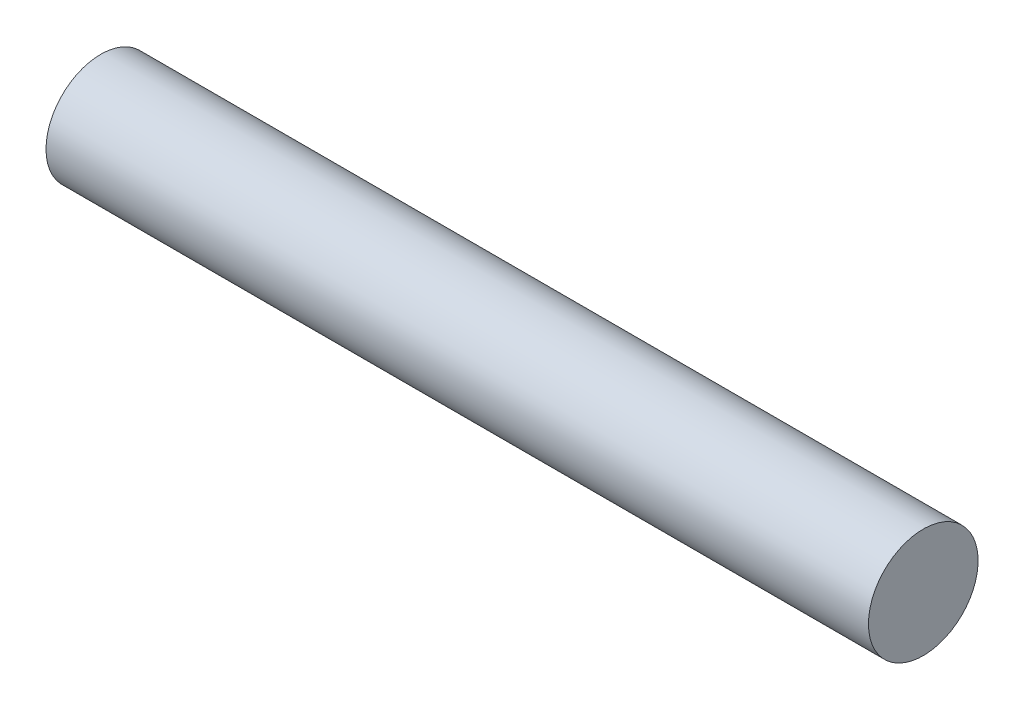
ISO-10303-21;
HEADER;
FILE_DESCRIPTION(('STEP AP214'),'2;1');
FILE_NAME('part.step','',(''),(''),'','','');
FILE_SCHEMA(('AUTOMOTIVE_DESIGN { 1 0 10303 214 1 1 1 1 }'));
ENDSEC;
DATA;
#1=APPLICATION_CONTEXT('core data for automotive mechanical design processes');
#2=APPLICATION_PROTOCOL_DEFINITION('international standard','automotive_design',2000,#1);
#3=PRODUCT_CONTEXT('',#1,'mechanical');
#4=PRODUCT('Part','Part','',(#3));
#5=PRODUCT_RELATED_PRODUCT_CATEGORY('part','',(#4));
#6=PRODUCT_DEFINITION_FORMATION('','',#4);
#7=PRODUCT_DEFINITION_CONTEXT('part definition',#1,'design');
#8=PRODUCT_DEFINITION('design','',#6,#7);
#9=PRODUCT_DEFINITION_SHAPE('','',#8);
#10=(LENGTH_UNIT() NAMED_UNIT(*) SI_UNIT(.MILLI.,.METRE.));
#11=(NAMED_UNIT(*) PLANE_ANGLE_UNIT() SI_UNIT($,.RADIAN.));
#12=(NAMED_UNIT(*) SI_UNIT($,.STERADIAN.) SOLID_ANGLE_UNIT());
#13=UNCERTAINTY_MEASURE_WITH_UNIT(LENGTH_MEASURE(1.E-05),#10,'distance_accuracy_value','');
#14=(GEOMETRIC_REPRESENTATION_CONTEXT(3) GLOBAL_UNCERTAINTY_ASSIGNED_CONTEXT((#13)) GLOBAL_UNIT_ASSIGNED_CONTEXT((#10,
#11,#12)) REPRESENTATION_CONTEXT('',''));
#15=CARTESIAN_POINT('',(0.,0.,0.));
#16=DIRECTION('',(0.,0.,1.));
#17=DIRECTION('',(1.,0.,0.));
#18=AXIS2_PLACEMENT_3D('',#15,#16,#17);
#19=CARTESIAN_POINT('',(57.15,7.62,0.));
#20=DIRECTION('',(-1.,0.,0.));
#21=DIRECTION('',(0.,0.,1.));
#22=AXIS2_PLACEMENT_3D('',#19,#20,#21);
#23=PLANE('',#22);
#24=CARTESIAN_POINT('',(57.15,0.,0.));
#25=DIRECTION('',(-1.,0.,0.));
#26=DIRECTION('',(0.,0.,1.));
#27=AXIS2_PLACEMENT_3D('',#24,#25,#26);
#28=CIRCLE('',#27,7.62);
#29=CARTESIAN_POINT('',(57.15,0.,7.62));
#30=VERTEX_POINT('',#29);
#31=EDGE_CURVE('E10',#30,#30,#28,.T.);
#32=ORIENTED_EDGE('',*,*,#31,.F.);
#33=EDGE_LOOP('',(#32));
#34=FACE_BOUND('',#33,.T.);
#35=ADVANCED_FACE('F43',(#34),#23,.F.);
#36=CARTESIAN_POINT('',(-27.068427672956,0.,0.));
#37=DIRECTION('',(-1.,0.,0.));
#38=DIRECTION('',(0.,0.,1.));
#39=AXIS2_PLACEMENT_3D('',#36,#37,#38);
#40=CYLINDRICAL_SURFACE('',#39,7.61999999999999);
#41=CARTESIAN_POINT('',(-57.15,0.,0.));
#42=DIRECTION('',(-1.,0.,0.));
#43=DIRECTION('',(0.,0.,1.));
#44=AXIS2_PLACEMENT_3D('',#41,#42,#43);
#45=CIRCLE('',#44,7.61999999999998);
#46=CARTESIAN_POINT('',(-57.15,0.,7.61999999999998));
#47=VERTEX_POINT('',#46);
#48=EDGE_CURVE('E49',#47,#47,#45,.T.);
#49=ORIENTED_EDGE('',*,*,#48,.F.);
#50=EDGE_LOOP('',(#49));
#51=FACE_BOUND('',#50,.T.);
#52=ORIENTED_EDGE('',*,*,#31,.T.);
#53=EDGE_LOOP('',(#52));
#54=FACE_BOUND('',#53,.T.);
#55=ADVANCED_FACE('F56',(#51,#54),#40,.T.);
#56=CARTESIAN_POINT('',(-57.15,7.61999999999998,0.));
#57=DIRECTION('',(1.,0.,0.));
#58=DIRECTION('',(0.,0.,-1.));
#59=AXIS2_PLACEMENT_3D('',#56,#57,#58);
#60=PLANE('',#59);
#61=ORIENTED_EDGE('',*,*,#48,.T.);
#62=EDGE_LOOP('',(#61));
#63=FACE_BOUND('',#62,.T.);
#64=ADVANCED_FACE('F60',(#63),#60,.F.);
#65=CLOSED_SHELL('',(#35,#55,#64));
#66=MANIFOLD_SOLID_BREP('B2',#65);
#67=ADVANCED_BREP_SHAPE_REPRESENTATION('',(#18,#66),#14);
#68=SHAPE_DEFINITION_REPRESENTATION(#9,#67);
ENDSEC;
END-ISO-10303-21;
